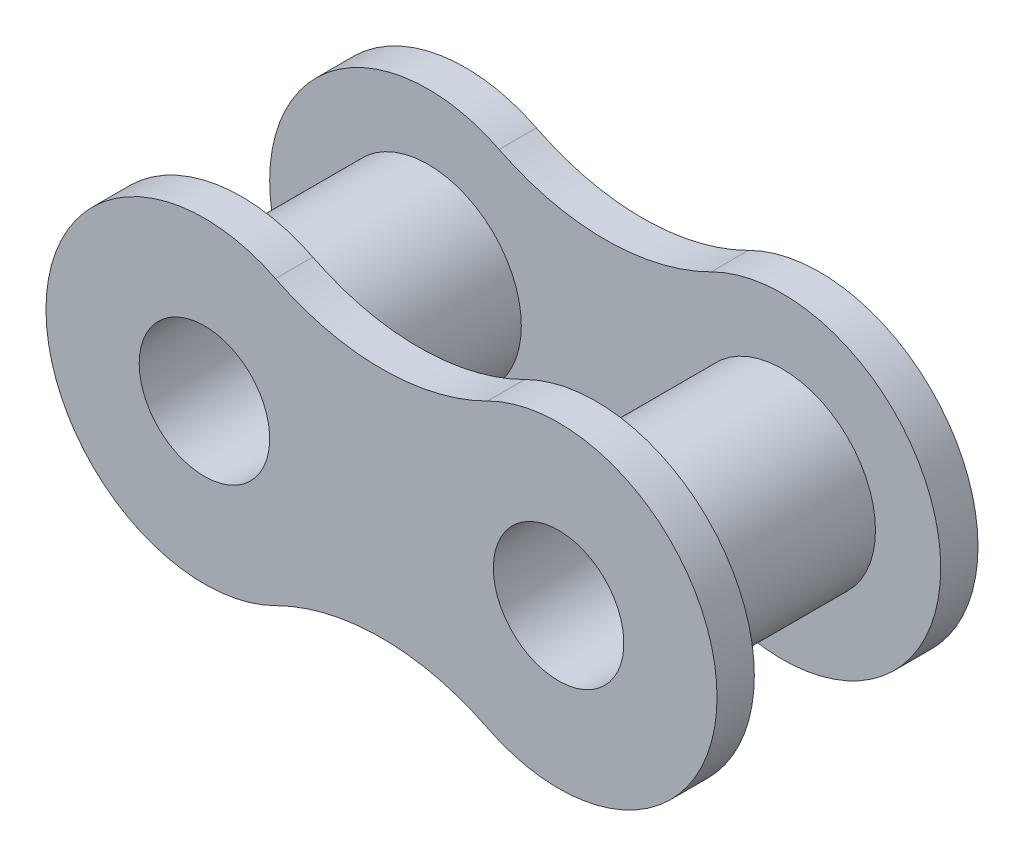
ISO-10303-21;
HEADER;
FILE_DESCRIPTION(('STEP AP214'),'2;1');
FILE_NAME('part.step','',(''),(''),'','','');
FILE_SCHEMA(('AUTOMOTIVE_DESIGN { 1 0 10303 214 1 1 1 1 }'));
ENDSEC;
DATA;
#1=APPLICATION_CONTEXT('core data for automotive mechanical design processes');
#2=APPLICATION_PROTOCOL_DEFINITION('international standard','automotive_design',2000,#1);
#3=PRODUCT_CONTEXT('',#1,'mechanical');
#4=PRODUCT('Part','Part','',(#3));
#5=PRODUCT_RELATED_PRODUCT_CATEGORY('part','',(#4));
#6=PRODUCT_DEFINITION_FORMATION('','',#4);
#7=PRODUCT_DEFINITION_CONTEXT('part definition',#1,'design');
#8=PRODUCT_DEFINITION('design','',#6,#7);
#9=PRODUCT_DEFINITION_SHAPE('','',#8);
#10=(LENGTH_UNIT() NAMED_UNIT(*) SI_UNIT(.MILLI.,.METRE.));
#11=(NAMED_UNIT(*) PLANE_ANGLE_UNIT() SI_UNIT($,.RADIAN.));
#12=(NAMED_UNIT(*) SI_UNIT($,.STERADIAN.) SOLID_ANGLE_UNIT());
#13=UNCERTAINTY_MEASURE_WITH_UNIT(LENGTH_MEASURE(1.E-05),#10,'distance_accuracy_value','');
#14=(GEOMETRIC_REPRESENTATION_CONTEXT(3) GLOBAL_UNCERTAINTY_ASSIGNED_CONTEXT((#13)) GLOBAL_UNIT_ASSIGNED_CONTEXT((#10,
#11,#12)) REPRESENTATION_CONTEXT('',''));
#15=CARTESIAN_POINT('',(0.,0.,0.));
#16=DIRECTION('',(0.,0.,1.));
#17=DIRECTION('',(1.,0.,0.));
#18=AXIS2_PLACEMENT_3D('',#15,#16,#17);
#19=CARTESIAN_POINT('',(0.,0.,5.));
#20=DIRECTION('',(0.,0.,-1.));
#21=DIRECTION('',(-1.,0.,0.));
#22=AXIS2_PLACEMENT_3D('',#19,#20,#21);
#23=CYLINDRICAL_SURFACE('',#22,2.5);
#24=CARTESIAN_POINT('',(0.,0.,5.));
#25=DIRECTION('',(0.,0.,1.));
#26=DIRECTION('',(1.,0.,0.));
#27=AXIS2_PLACEMENT_3D('',#24,#25,#26);
#28=CIRCLE('',#27,2.5);
#29=CARTESIAN_POINT('',(2.5,0.,5.));
#30=VERTEX_POINT('',#29);
#31=EDGE_CURVE('E25',#30,#30,#28,.T.);
#32=ORIENTED_EDGE('',*,*,#31,.F.);
#33=EDGE_LOOP('',(#32));
#34=FACE_BOUND('',#33,.T.);
#35=CARTESIAN_POINT('',(0.,0.,0.));
#36=DIRECTION('',(0.,0.,1.));
#37=DIRECTION('',(1.,0.,0.));
#38=AXIS2_PLACEMENT_3D('',#35,#36,#37);
#39=CIRCLE('',#38,2.5);
#40=CARTESIAN_POINT('',(2.5,0.,0.));
#41=VERTEX_POINT('',#40);
#42=EDGE_CURVE('E120',#41,#41,#39,.T.);
#43=ORIENTED_EDGE('',*,*,#42,.T.);
#44=EDGE_LOOP('',(#43));
#45=FACE_BOUND('',#44,.T.);
#46=ADVANCED_FACE('F17',(#34,#45),#23,.T.);
#47=CARTESIAN_POINT('',(4.75,9.46527777777778,6.));
#48=DIRECTION('',(0.,0.,-1.));
#49=DIRECTION('',(-1.,0.,0.));
#50=AXIS2_PLACEMENT_3D('',#47,#48,#49);
#51=CYLINDRICAL_SURFACE('',#50,6.34027777777778);
#52=CARTESIAN_POINT('',(4.75,9.46527777777778,5.));
#53=DIRECTION('',(0.,0.,-1.));
#54=DIRECTION('',(1.,0.,0.));
#55=AXIS2_PLACEMENT_3D('',#52,#53,#54);
#56=CIRCLE('',#55,6.34027777777778);
#57=CARTESIAN_POINT('',(7.59377049180328,3.79852459016393,5.));
#58=VERTEX_POINT('',#57);
#59=CARTESIAN_POINT('',(1.90622950819672,3.79852459016393,5.));
#60=VERTEX_POINT('',#59);
#61=EDGE_CURVE('E133',#58,#60,#56,.T.);
#62=ORIENTED_EDGE('',*,*,#61,.T.);
#63=DIRECTION('',(0.,0.,-1.));
#64=VECTOR('',#63,1.);
#65=CARTESIAN_POINT('',(1.90622950819672,3.79852459016393,6.));
#66=LINE('',#65,#64);
#67=CARTESIAN_POINT('',(1.90622950819672,3.79852459016393,6.));
#68=VERTEX_POINT('',#67);
#69=EDGE_CURVE('E145',#68,#60,#66,.T.);
#70=ORIENTED_EDGE('',*,*,#69,.F.);
#71=CARTESIAN_POINT('',(4.75,9.46527777777778,6.));
#72=DIRECTION('',(0.,0.,-1.));
#73=DIRECTION('',(1.,0.,0.));
#74=AXIS2_PLACEMENT_3D('',#71,#72,#73);
#75=CIRCLE('',#74,6.34027777777778);
#76=CARTESIAN_POINT('',(7.59377049180328,3.79852459016393,6.));
#77=VERTEX_POINT('',#76);
#78=EDGE_CURVE('E126',#77,#68,#75,.T.);
#79=ORIENTED_EDGE('',*,*,#78,.F.);
#80=DIRECTION('',(0.,0.,-1.));
#81=VECTOR('',#80,1.);
#82=CARTESIAN_POINT('',(7.59377049180328,3.79852459016393,6.));
#83=LINE('',#82,#81);
#84=EDGE_CURVE('E132',#77,#58,#83,.T.);
#85=ORIENTED_EDGE('',*,*,#84,.T.);
#86=EDGE_LOOP('',(#62,#70,#79,#85));
#87=FACE_BOUND('',#86,.T.);
#88=ADVANCED_FACE('F210',(#87),#51,.F.);
#89=CARTESIAN_POINT('',(0.,0.,6.));
#90=DIRECTION('',(0.,0.,-1.));
#91=DIRECTION('',(-1.,0.,0.));
#92=AXIS2_PLACEMENT_3D('',#89,#90,#91);
#93=CYLINDRICAL_SURFACE('',#92,4.25);
#94=CARTESIAN_POINT('',(0.,0.,5.));
#95=DIRECTION('',(0.,0.,1.));
#96=DIRECTION('',(1.,0.,0.));
#97=AXIS2_PLACEMENT_3D('',#94,#95,#96);
#98=CIRCLE('',#97,4.25);
#99=CARTESIAN_POINT('',(1.90622950819672,-3.79852459016393,5.));
#100=VERTEX_POINT('',#99);
#101=EDGE_CURVE('E136',#60,#100,#98,.T.);
#102=ORIENTED_EDGE('',*,*,#101,.T.);
#103=DIRECTION('',(0.,0.,-1.));
#104=VECTOR('',#103,1.);
#105=CARTESIAN_POINT('',(1.90622950819672,-3.79852459016393,6.));
#106=LINE('',#105,#104);
#107=CARTESIAN_POINT('',(1.90622950819672,-3.79852459016393,6.));
#108=VERTEX_POINT('',#107);
#109=EDGE_CURVE('E143',#108,#100,#106,.T.);
#110=ORIENTED_EDGE('',*,*,#109,.F.);
#111=CARTESIAN_POINT('',(0.,0.,6.));
#112=DIRECTION('',(0.,0.,1.));
#113=DIRECTION('',(1.,0.,0.));
#114=AXIS2_PLACEMENT_3D('',#111,#112,#113);
#115=CIRCLE('',#114,4.25);
#116=EDGE_CURVE('E65',#68,#108,#115,.T.);
#117=ORIENTED_EDGE('',*,*,#116,.F.);
#118=ORIENTED_EDGE('',*,*,#69,.T.);
#119=EDGE_LOOP('',(#102,#110,#117,#118));
#120=FACE_BOUND('',#119,.T.);
#121=ADVANCED_FACE('F216',(#120),#93,.T.);
#122=CARTESIAN_POINT('',(4.75,-9.46527777777778,6.));
#123=DIRECTION('',(0.,0.,-1.));
#124=DIRECTION('',(-1.,0.,0.));
#125=AXIS2_PLACEMENT_3D('',#122,#123,#124);
#126=CYLINDRICAL_SURFACE('',#125,6.34027777777778);
#127=CARTESIAN_POINT('',(4.75,-9.46527777777778,5.));
#128=DIRECTION('',(0.,0.,-1.));
#129=DIRECTION('',(-1.,0.,0.));
#130=AXIS2_PLACEMENT_3D('',#127,#128,#129);
#131=CIRCLE('',#130,6.34027777777778);
#132=CARTESIAN_POINT('',(7.59377049180328,-3.79852459016393,5.));
#133=VERTEX_POINT('',#132);
#134=EDGE_CURVE('E51',#100,#133,#131,.T.);
#135=ORIENTED_EDGE('',*,*,#134,.T.);
#136=DIRECTION('',(0.,0.,-1.));
#137=VECTOR('',#136,1.);
#138=CARTESIAN_POINT('',(7.59377049180328,-3.79852459016393,6.));
#139=LINE('',#138,#137);
#140=CARTESIAN_POINT('',(7.59377049180328,-3.79852459016393,6.));
#141=VERTEX_POINT('',#140);
#142=EDGE_CURVE('E141',#141,#133,#139,.T.);
#143=ORIENTED_EDGE('',*,*,#142,.F.);
#144=CARTESIAN_POINT('',(4.75,-9.46527777777778,6.));
#145=DIRECTION('',(0.,0.,-1.));
#146=DIRECTION('',(-1.,0.,0.));
#147=AXIS2_PLACEMENT_3D('',#144,#145,#146);
#148=CIRCLE('',#147,6.34027777777778);
#149=EDGE_CURVE('E129',#108,#141,#148,.T.);
#150=ORIENTED_EDGE('',*,*,#149,.F.);
#151=ORIENTED_EDGE('',*,*,#109,.T.);
#152=EDGE_LOOP('',(#135,#143,#150,#151));
#153=FACE_BOUND('',#152,.T.);
#154=ADVANCED_FACE('F232',(#153),#126,.F.);
#155=CARTESIAN_POINT('',(9.5,0.,6.));
#156=DIRECTION('',(0.,0.,-1.));
#157=DIRECTION('',(-1.,0.,0.));
#158=AXIS2_PLACEMENT_3D('',#155,#156,#157);
#159=CYLINDRICAL_SURFACE('',#158,4.25);
#160=CARTESIAN_POINT('',(9.5,0.,5.));
#161=DIRECTION('',(0.,0.,1.));
#162=DIRECTION('',(1.,0.,0.));
#163=AXIS2_PLACEMENT_3D('',#160,#161,#162);
#164=CIRCLE('',#163,4.25);
#165=EDGE_CURVE('E57',#133,#58,#164,.T.);
#166=ORIENTED_EDGE('',*,*,#165,.T.);
#167=ORIENTED_EDGE('',*,*,#84,.F.);
#168=CARTESIAN_POINT('',(9.5,0.,6.));
#169=DIRECTION('',(0.,0.,1.));
#170=DIRECTION('',(1.,0.,0.));
#171=AXIS2_PLACEMENT_3D('',#168,#169,#170);
#172=CIRCLE('',#171,4.25);
#173=EDGE_CURVE('E33',#141,#77,#172,.T.);
#174=ORIENTED_EDGE('',*,*,#173,.F.);
#175=ORIENTED_EDGE('',*,*,#142,.T.);
#176=EDGE_LOOP('',(#166,#167,#174,#175));
#177=FACE_BOUND('',#176,.T.);
#178=ADVANCED_FACE('F230',(#177),#159,.T.);
#179=CARTESIAN_POINT('',(7.125,4.73263888888889,6.));
#180=DIRECTION('',(0.,0.,1.));
#181=DIRECTION('',(1.,0.,0.));
#182=AXIS2_PLACEMENT_3D('',#179,#180,#181);
#183=PLANE('',#182);
#184=CARTESIAN_POINT('',(0.,0.,6.));
#185=DIRECTION('',(0.,0.,-1.));
#186=DIRECTION('',(-1.,0.,0.));
#187=AXIS2_PLACEMENT_3D('',#184,#185,#186);
#188=CIRCLE('',#187,1.75);
#189=CARTESIAN_POINT('',(-1.75,0.,6.));
#190=VERTEX_POINT('',#189);
#191=EDGE_CURVE('E162',#190,#190,#188,.T.);
#192=ORIENTED_EDGE('',*,*,#191,.T.);
#193=EDGE_LOOP('',(#192));
#194=FACE_BOUND('',#193,.T.);
#195=CARTESIAN_POINT('',(9.5,0.,6.));
#196=DIRECTION('',(0.,0.,-1.));
#197=DIRECTION('',(-1.,0.,0.));
#198=AXIS2_PLACEMENT_3D('',#195,#196,#197);
#199=CIRCLE('',#198,1.75);
#200=CARTESIAN_POINT('',(7.75,0.,6.));
#201=VERTEX_POINT('',#200);
#202=EDGE_CURVE('E185',#201,#201,#199,.T.);
#203=ORIENTED_EDGE('',*,*,#202,.T.);
#204=EDGE_LOOP('',(#203));
#205=FACE_BOUND('',#204,.T.);
#206=ORIENTED_EDGE('',*,*,#78,.T.);
#207=ORIENTED_EDGE('',*,*,#116,.T.);
#208=ORIENTED_EDGE('',*,*,#149,.T.);
#209=ORIENTED_EDGE('',*,*,#173,.T.);
#210=EDGE_LOOP('',(#206,#207,#208,#209));
#211=FACE_BOUND('',#210,.T.);
#212=ADVANCED_FACE('F224',(#194,#205,#211),#183,.T.);
#213=CARTESIAN_POINT('',(7.125,4.73263888888889,5.));
#214=DIRECTION('',(0.,0.,1.));
#215=DIRECTION('',(1.,0.,0.));
#216=AXIS2_PLACEMENT_3D('',#213,#214,#215);
#217=PLANE('',#216);
#218=CARTESIAN_POINT('',(9.5,0.,5.));
#219=DIRECTION('',(0.,0.,1.));
#220=DIRECTION('',(1.,0.,0.));
#221=AXIS2_PLACEMENT_3D('',#218,#219,#220);
#222=CIRCLE('',#221,2.5);
#223=CARTESIAN_POINT('',(12.,0.,5.));
#224=VERTEX_POINT('',#223);
#225=EDGE_CURVE('E11',#224,#224,#222,.F.);
#226=ORIENTED_EDGE('',*,*,#225,.F.);
#227=EDGE_LOOP('',(#226));
#228=FACE_BOUND('',#227,.T.);
#229=ORIENTED_EDGE('',*,*,#31,.T.);
#230=EDGE_LOOP('',(#229));
#231=FACE_BOUND('',#230,.T.);
#232=ORIENTED_EDGE('',*,*,#61,.F.);
#233=ORIENTED_EDGE('',*,*,#165,.F.);
#234=ORIENTED_EDGE('',*,*,#134,.F.);
#235=ORIENTED_EDGE('',*,*,#101,.F.);
#236=EDGE_LOOP('',(#232,#233,#234,#235));
#237=FACE_BOUND('',#236,.T.);
#238=ADVANCED_FACE('F220',(#228,#231,#237),#217,.F.);
#239=CARTESIAN_POINT('',(9.5,0.,5.));
#240=DIRECTION('',(0.,0.,-1.));
#241=DIRECTION('',(-1.,0.,0.));
#242=AXIS2_PLACEMENT_3D('',#239,#240,#241);
#243=CYLINDRICAL_SURFACE('',#242,2.5);
#244=ORIENTED_EDGE('',*,*,#225,.T.);
#245=EDGE_LOOP('',(#244));
#246=FACE_BOUND('',#245,.T.);
#247=CARTESIAN_POINT('',(9.5,0.,0.));
#248=DIRECTION('',(0.,0.,1.));
#249=DIRECTION('',(1.,0.,0.));
#250=AXIS2_PLACEMENT_3D('',#247,#248,#249);
#251=CIRCLE('',#250,2.5);
#252=CARTESIAN_POINT('',(12.,0.,0.));
#253=VERTEX_POINT('',#252);
#254=EDGE_CURVE('E117',#253,#253,#251,.T.);
#255=ORIENTED_EDGE('',*,*,#254,.T.);
#256=EDGE_LOOP('',(#255));
#257=FACE_BOUND('',#256,.T.);
#258=ADVANCED_FACE('F223',(#246,#257),#243,.T.);
#259=CARTESIAN_POINT('',(9.5,0.,-1.));
#260=DIRECTION('',(0.,0.,1.));
#261=DIRECTION('',(1.,0.,0.));
#262=AXIS2_PLACEMENT_3D('',#259,#260,#261);
#263=CYLINDRICAL_SURFACE('',#262,4.25);
#264=CARTESIAN_POINT('',(9.5,0.,0.));
#265=DIRECTION('',(0.,0.,-1.));
#266=DIRECTION('',(-1.,0.,0.));
#267=AXIS2_PLACEMENT_3D('',#264,#265,#266);
#268=CIRCLE('',#267,4.25);
#269=CARTESIAN_POINT('',(7.59377049180327,3.79852459016393,0.));
#270=VERTEX_POINT('',#269);
#271=CARTESIAN_POINT('',(7.59377049180328,-3.79852459016393,0.));
#272=VERTEX_POINT('',#271);
#273=EDGE_CURVE('E116',#270,#272,#268,.T.);
#274=ORIENTED_EDGE('',*,*,#273,.T.);
#275=DIRECTION('',(0.,0.,1.));
#276=VECTOR('',#275,1.);
#277=CARTESIAN_POINT('',(7.59377049180328,-3.79852459016393,-1.));
#278=LINE('',#277,#276);
#279=CARTESIAN_POINT('',(7.59377049180328,-3.79852459016393,-1.));
#280=VERTEX_POINT('',#279);
#281=EDGE_CURVE('E96',#280,#272,#278,.T.);
#282=ORIENTED_EDGE('',*,*,#281,.F.);
#283=CARTESIAN_POINT('',(9.5,0.,-1.));
#284=DIRECTION('',(0.,0.,-1.));
#285=DIRECTION('',(-1.,0.,0.));
#286=AXIS2_PLACEMENT_3D('',#283,#284,#285);
#287=CIRCLE('',#286,4.25);
#288=CARTESIAN_POINT('',(7.59377049180327,3.79852459016393,-1.));
#289=VERTEX_POINT('',#288);
#290=EDGE_CURVE('E103',#289,#280,#287,.T.);
#291=ORIENTED_EDGE('',*,*,#290,.F.);
#292=DIRECTION('',(0.,0.,1.));
#293=VECTOR('',#292,1.);
#294=CARTESIAN_POINT('',(7.59377049180327,3.79852459016393,-1.));
#295=LINE('',#294,#293);
#296=EDGE_CURVE('E174',#289,#270,#295,.T.);
#297=ORIENTED_EDGE('',*,*,#296,.T.);
#298=EDGE_LOOP('',(#274,#282,#291,#297));
#299=FACE_BOUND('',#298,.T.);
#300=ADVANCED_FACE('F114',(#299),#263,.T.);
#301=CARTESIAN_POINT('',(4.75,-9.46527777777778,-1.));
#302=DIRECTION('',(0.,0.,1.));
#303=DIRECTION('',(1.,0.,0.));
#304=AXIS2_PLACEMENT_3D('',#301,#302,#303);
#305=CYLINDRICAL_SURFACE('',#304,6.34027777777778);
#306=CARTESIAN_POINT('',(4.75,-9.46527777777778,0.));
#307=DIRECTION('',(0.,0.,1.));
#308=DIRECTION('',(-1.,0.,0.));
#309=AXIS2_PLACEMENT_3D('',#306,#307,#308);
#310=CIRCLE('',#309,6.34027777777778);
#311=CARTESIAN_POINT('',(1.90622950819673,-3.79852459016393,0.));
#312=VERTEX_POINT('',#311);
#313=EDGE_CURVE('E161',#272,#312,#310,.T.);
#314=ORIENTED_EDGE('',*,*,#313,.T.);
#315=DIRECTION('',(0.,0.,1.));
#316=VECTOR('',#315,1.);
#317=CARTESIAN_POINT('',(1.90622950819673,-3.79852459016393,-1.));
#318=LINE('',#317,#316);
#319=CARTESIAN_POINT('',(1.90622950819673,-3.79852459016393,-1.));
#320=VERTEX_POINT('',#319);
#321=EDGE_CURVE('E99',#320,#312,#318,.T.);
#322=ORIENTED_EDGE('',*,*,#321,.F.);
#323=CARTESIAN_POINT('',(4.75,-9.46527777777778,-1.));
#324=DIRECTION('',(0.,0.,1.));
#325=DIRECTION('',(-1.,0.,0.));
#326=AXIS2_PLACEMENT_3D('',#323,#324,#325);
#327=CIRCLE('',#326,6.34027777777778);
#328=EDGE_CURVE('E92',#280,#320,#327,.T.);
#329=ORIENTED_EDGE('',*,*,#328,.F.);
#330=ORIENTED_EDGE('',*,*,#281,.T.);
#331=EDGE_LOOP('',(#314,#322,#329,#330));
#332=FACE_BOUND('',#331,.T.);
#333=ADVANCED_FACE('F94',(#332),#305,.F.);
#334=CARTESIAN_POINT('',(0.,0.,-1.));
#335=DIRECTION('',(0.,0.,1.));
#336=DIRECTION('',(1.,0.,0.));
#337=AXIS2_PLACEMENT_3D('',#334,#335,#336);
#338=CYLINDRICAL_SURFACE('',#337,4.25);
#339=CARTESIAN_POINT('',(0.,0.,0.));
#340=DIRECTION('',(0.,0.,-1.));
#341=DIRECTION('',(-1.,0.,0.));
#342=AXIS2_PLACEMENT_3D('',#339,#340,#341);
#343=CIRCLE('',#342,4.25);
#344=CARTESIAN_POINT('',(1.90622950819673,3.79852459016393,0.));
#345=VERTEX_POINT('',#344);
#346=EDGE_CURVE('E164',#312,#345,#343,.T.);
#347=ORIENTED_EDGE('',*,*,#346,.T.);
#348=DIRECTION('',(0.,0.,1.));
#349=VECTOR('',#348,1.);
#350=CARTESIAN_POINT('',(1.90622950819673,3.79852459016393,-1.));
#351=LINE('',#350,#349);
#352=CARTESIAN_POINT('',(1.90622950819673,3.79852459016393,-1.));
#353=VERTEX_POINT('',#352);
#354=EDGE_CURVE('E122',#353,#345,#351,.T.);
#355=ORIENTED_EDGE('',*,*,#354,.F.);
#356=CARTESIAN_POINT('',(0.,0.,-1.));
#357=DIRECTION('',(0.,0.,-1.));
#358=DIRECTION('',(-1.,0.,0.));
#359=AXIS2_PLACEMENT_3D('',#356,#357,#358);
#360=CIRCLE('',#359,4.25);
#361=EDGE_CURVE('E102',#320,#353,#360,.T.);
#362=ORIENTED_EDGE('',*,*,#361,.F.);
#363=ORIENTED_EDGE('',*,*,#321,.T.);
#364=EDGE_LOOP('',(#347,#355,#362,#363));
#365=FACE_BOUND('',#364,.T.);
#366=ADVANCED_FACE('F180',(#365),#338,.T.);
#367=CARTESIAN_POINT('',(4.75,9.46527777777778,-1.));
#368=DIRECTION('',(0.,0.,1.));
#369=DIRECTION('',(1.,0.,0.));
#370=AXIS2_PLACEMENT_3D('',#367,#368,#369);
#371=CYLINDRICAL_SURFACE('',#370,6.34027777777778);
#372=CARTESIAN_POINT('',(4.75,9.46527777777778,0.));
#373=DIRECTION('',(0.,0.,1.));
#374=DIRECTION('',(-1.,0.,0.));
#375=AXIS2_PLACEMENT_3D('',#372,#373,#374);
#376=CIRCLE('',#375,6.34027777777778);
#377=EDGE_CURVE('E112',#345,#270,#376,.T.);
#378=ORIENTED_EDGE('',*,*,#377,.T.);
#379=ORIENTED_EDGE('',*,*,#296,.F.);
#380=CARTESIAN_POINT('',(4.75,9.46527777777778,-1.));
#381=DIRECTION('',(0.,0.,1.));
#382=DIRECTION('',(-1.,0.,0.));
#383=AXIS2_PLACEMENT_3D('',#380,#381,#382);
#384=CIRCLE('',#383,6.34027777777778);
#385=EDGE_CURVE('E108',#353,#289,#384,.T.);
#386=ORIENTED_EDGE('',*,*,#385,.F.);
#387=ORIENTED_EDGE('',*,*,#354,.T.);
#388=EDGE_LOOP('',(#378,#379,#386,#387));
#389=FACE_BOUND('',#388,.T.);
#390=ADVANCED_FACE('F178',(#389),#371,.F.);
#391=CARTESIAN_POINT('',(7.125,-4.73263888888889,-1.));
#392=DIRECTION('',(0.,0.,-1.));
#393=DIRECTION('',(-1.,0.,0.));
#394=AXIS2_PLACEMENT_3D('',#391,#392,#393);
#395=PLANE('',#394);
#396=CARTESIAN_POINT('',(0.,0.,-1.));
#397=DIRECTION('',(0.,0.,-1.));
#398=DIRECTION('',(-1.,0.,0.));
#399=AXIS2_PLACEMENT_3D('',#396,#397,#398);
#400=CIRCLE('',#399,1.75);
#401=CARTESIAN_POINT('',(-1.75,0.,-1.));
#402=VERTEX_POINT('',#401);
#403=EDGE_CURVE('E167',#402,#402,#400,.T.);
#404=ORIENTED_EDGE('',*,*,#403,.F.);
#405=EDGE_LOOP('',(#404));
#406=FACE_BOUND('',#405,.T.);
#407=CARTESIAN_POINT('',(9.5,0.,-1.));
#408=DIRECTION('',(0.,0.,-1.));
#409=DIRECTION('',(-1.,0.,0.));
#410=AXIS2_PLACEMENT_3D('',#407,#408,#409);
#411=CIRCLE('',#410,1.75);
#412=CARTESIAN_POINT('',(7.75,0.,-1.));
#413=VERTEX_POINT('',#412);
#414=EDGE_CURVE('E182',#413,#413,#411,.T.);
#415=ORIENTED_EDGE('',*,*,#414,.F.);
#416=EDGE_LOOP('',(#415));
#417=FACE_BOUND('',#416,.T.);
#418=ORIENTED_EDGE('',*,*,#290,.T.);
#419=ORIENTED_EDGE('',*,*,#328,.T.);
#420=ORIENTED_EDGE('',*,*,#361,.T.);
#421=ORIENTED_EDGE('',*,*,#385,.T.);
#422=EDGE_LOOP('',(#418,#419,#420,#421));
#423=FACE_BOUND('',#422,.T.);
#424=ADVANCED_FACE('F106',(#406,#417,#423),#395,.T.);
#425=CARTESIAN_POINT('',(7.125,-4.73263888888889,0.));
#426=DIRECTION('',(0.,0.,-1.));
#427=DIRECTION('',(-1.,0.,0.));
#428=AXIS2_PLACEMENT_3D('',#425,#426,#427);
#429=PLANE('',#428);
#430=ORIENTED_EDGE('',*,*,#42,.F.);
#431=EDGE_LOOP('',(#430));
#432=FACE_BOUND('',#431,.T.);
#433=ORIENTED_EDGE('',*,*,#254,.F.);
#434=EDGE_LOOP('',(#433));
#435=FACE_BOUND('',#434,.T.);
#436=ORIENTED_EDGE('',*,*,#273,.F.);
#437=ORIENTED_EDGE('',*,*,#377,.F.);
#438=ORIENTED_EDGE('',*,*,#346,.F.);
#439=ORIENTED_EDGE('',*,*,#313,.F.);
#440=EDGE_LOOP('',(#436,#437,#438,#439));
#441=FACE_BOUND('',#440,.T.);
#442=ADVANCED_FACE('F152',(#432,#435,#441),#429,.F.);
#443=CARTESIAN_POINT('',(9.5,0.,6.));
#444=DIRECTION('',(0.,0.,-1.));
#445=DIRECTION('',(-1.,0.,0.));
#446=AXIS2_PLACEMENT_3D('',#443,#444,#445);
#447=CYLINDRICAL_SURFACE('',#446,1.75);
#448=ORIENTED_EDGE('',*,*,#202,.F.);
#449=EDGE_LOOP('',(#448));
#450=FACE_BOUND('',#449,.T.);
#451=ORIENTED_EDGE('',*,*,#414,.T.);
#452=EDGE_LOOP('',(#451));
#453=FACE_BOUND('',#452,.T.);
#454=ADVANCED_FACE('F155',(#450,#453),#447,.F.);
#455=CARTESIAN_POINT('',(0.,0.,6.));
#456=DIRECTION('',(0.,0.,-1.));
#457=DIRECTION('',(-1.,0.,0.));
#458=AXIS2_PLACEMENT_3D('',#455,#456,#457);
#459=CYLINDRICAL_SURFACE('',#458,1.75);
#460=ORIENTED_EDGE('',*,*,#191,.F.);
#461=EDGE_LOOP('',(#460));
#462=FACE_BOUND('',#461,.T.);
#463=ORIENTED_EDGE('',*,*,#403,.T.);
#464=EDGE_LOOP('',(#463));
#465=FACE_BOUND('',#464,.T.);
#466=ADVANCED_FACE('F191',(#462,#465),#459,.F.);
#467=CLOSED_SHELL('',(#46,#88,#121,#154,#178,#212,#238,#258,#300,#333,#366,#390,#424,#442,#454,#466));
#468=MANIFOLD_SOLID_BREP('B1',#467);
#469=ADVANCED_BREP_SHAPE_REPRESENTATION('',(#18,#468),#14);
#470=SHAPE_DEFINITION_REPRESENTATION(#9,#469);
ENDSEC;
END-ISO-10303-21;
